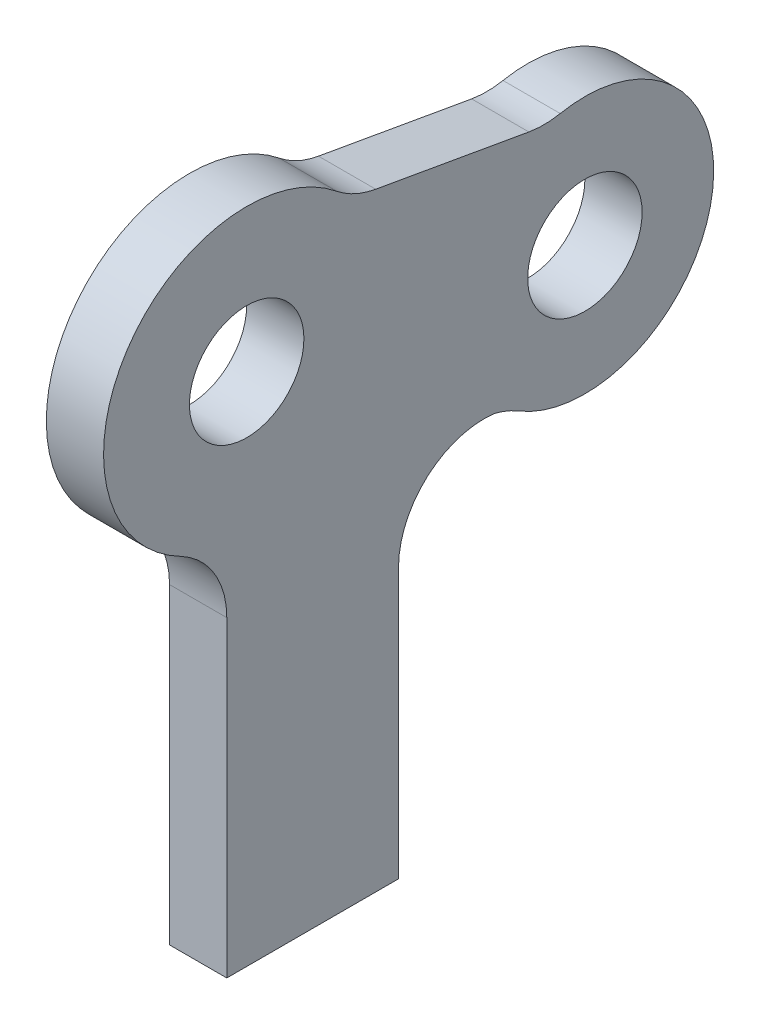
ISO-10303-21;
HEADER;
FILE_DESCRIPTION(('STEP AP214'),'2;1');
FILE_NAME('part.step','',(''),(''),'','','');
FILE_SCHEMA(('AUTOMOTIVE_DESIGN { 1 0 10303 214 1 1 1 1 }'));
ENDSEC;
DATA;
#1=APPLICATION_CONTEXT('core data for automotive mechanical design processes');
#2=APPLICATION_PROTOCOL_DEFINITION('international standard','automotive_design',2000,#1);
#3=PRODUCT_CONTEXT('',#1,'mechanical');
#4=PRODUCT('Part','Part','',(#3));
#5=PRODUCT_RELATED_PRODUCT_CATEGORY('part','',(#4));
#6=PRODUCT_DEFINITION_FORMATION('','',#4);
#7=PRODUCT_DEFINITION_CONTEXT('part definition',#1,'design');
#8=PRODUCT_DEFINITION('design','',#6,#7);
#9=PRODUCT_DEFINITION_SHAPE('','',#8);
#10=(LENGTH_UNIT() NAMED_UNIT(*) SI_UNIT(.MILLI.,.METRE.));
#11=(NAMED_UNIT(*) PLANE_ANGLE_UNIT() SI_UNIT($,.RADIAN.));
#12=(NAMED_UNIT(*) SI_UNIT($,.STERADIAN.) SOLID_ANGLE_UNIT());
#13=UNCERTAINTY_MEASURE_WITH_UNIT(LENGTH_MEASURE(1.E-05),#10,'distance_accuracy_value','');
#14=(GEOMETRIC_REPRESENTATION_CONTEXT(3) GLOBAL_UNCERTAINTY_ASSIGNED_CONTEXT((#13)) GLOBAL_UNIT_ASSIGNED_CONTEXT((#10,
#11,#12)) REPRESENTATION_CONTEXT('',''));
#15=CARTESIAN_POINT('',(0.,0.,0.));
#16=DIRECTION('',(0.,0.,1.));
#17=DIRECTION('',(1.,0.,0.));
#18=AXIS2_PLACEMENT_3D('',#15,#16,#17);
#19=CARTESIAN_POINT('',(0.,0.,0.));
#20=DIRECTION('',(1.,0.,0.));
#21=DIRECTION('',(0.,0.,-1.));
#22=AXIS2_PLACEMENT_3D('',#19,#20,#21);
#23=PLANE('',#22);
#24=CARTESIAN_POINT('',(0.,0.,0.));
#25=DIRECTION('',(1.,0.,0.));
#26=DIRECTION('',(0.,0.,-1.));
#27=AXIS2_PLACEMENT_3D('',#24,#25,#26);
#28=CIRCLE('',#27,2.);
#29=CARTESIAN_POINT('',(0.,0.,-2.));
#30=VERTEX_POINT('',#29);
#31=EDGE_CURVE('E325',#30,#30,#28,.T.);
#32=ORIENTED_EDGE('',*,*,#31,.T.);
#33=EDGE_LOOP('',(#32));
#34=FACE_BOUND('',#33,.T.);
#35=CARTESIAN_POINT('',(0.,-2.08377813200312,-11.8176930361465));
#36=DIRECTION('',(1.,0.,0.));
#37=DIRECTION('',(0.,0.,-1.));
#38=AXIS2_PLACEMENT_3D('',#35,#36,#37);
#39=CIRCLE('',#38,2.);
#40=CARTESIAN_POINT('',(0.,-2.08377813200312,-13.8176930361465));
#41=VERTEX_POINT('',#40);
#42=EDGE_CURVE('E326',#41,#41,#39,.T.);
#43=ORIENTED_EDGE('',*,*,#42,.T.);
#44=EDGE_LOOP('',(#43));
#45=FACE_BOUND('',#44,.T.);
#46=DIRECTION('',(0.,-1.,0.));
#47=VECTOR('',#46,1.);
#48=CARTESIAN_POINT('',(0.,-3.93923101204883,0.694592710667707));
#49=LINE('',#48,#47);
#50=CARTESIAN_POINT('',(0.,-7.09577231189678,0.694592710667707));
#51=VERTEX_POINT('',#50);
#52=CARTESIAN_POINT('',(0.,-18.,0.694592710667706));
#53=VERTEX_POINT('',#52);
#54=EDGE_CURVE('E212',#51,#53,#49,.T.);
#55=ORIENTED_EDGE('',*,*,#54,.F.);
#56=CARTESIAN_POINT('',(0.,-7.09577231189678,3.69459271066771));
#57=DIRECTION('',(1.,0.,0.));
#58=DIRECTION('',(0.,0.,-1.));
#59=AXIS2_PLACEMENT_3D('',#56,#57,#58);
#60=CIRCLE('',#59,3.);
#61=CARTESIAN_POINT('',(0.,-4.43485769493549,2.30912044416732));
#62=VERTEX_POINT('',#61);
#63=EDGE_CURVE('E113',#51,#62,#60,.T.);
#64=ORIENTED_EDGE('',*,*,#63,.T.);
#65=CARTESIAN_POINT('',(0.,0.,0.));
#66=DIRECTION('',(1.,0.,0.));
#67=DIRECTION('',(0.,0.,-1.));
#68=AXIS2_PLACEMENT_3D('',#65,#66,#67);
#69=CIRCLE('',#68,5.);
#70=CARTESIAN_POINT('',(0.,3.88819860680137,-3.14355079393795));
#71=VERTEX_POINT('',#70);
#72=EDGE_CURVE('E258',#71,#62,#69,.T.);
#73=ORIENTED_EDGE('',*,*,#72,.F.);
#74=CARTESIAN_POINT('',(0.,6.22111777088219,-5.02968127030071));
#75=DIRECTION('',(1.,0.,0.));
#76=DIRECTION('',(0.,0.,-1.));
#77=AXIS2_PLACEMENT_3D('',#74,#75,#76);
#78=CIRCLE('',#77,3.);
#79=CARTESIAN_POINT('',(0.,3.26669451184556,-4.50873673729993));
#80=VERTEX_POINT('',#79);
#81=EDGE_CURVE('E251',#71,#80,#78,.T.);
#82=ORIENTED_EDGE('',*,*,#81,.T.);
#83=DIRECTION('',(0.,-0.173648177666926,-0.984807753012209));
#84=VECTOR('',#83,1.);
#85=CARTESIAN_POINT('',(0.,3.93923101204883,-0.694592710667706));
#86=LINE('',#85,#84);
#87=CARTESIAN_POINT('',(0.,2.3230149076432,-9.86060972015695));
#88=VERTEX_POINT('',#87);
#89=EDGE_CURVE('E335',#80,#88,#86,.T.);
#90=ORIENTED_EDGE('',*,*,#89,.T.);
#91=CARTESIAN_POINT('',(0.,5.27743816667983,-10.3815542531577));
#92=DIRECTION('',(1.,0.,0.));
#93=DIRECTION('',(0.,0.,-1.));
#94=AXIS2_PLACEMENT_3D('',#91,#92,#93);
#95=CIRCLE('',#94,3.);
#96=CARTESIAN_POINT('',(0.,2.33295164720665,-10.9560097663532));
#97=VERTEX_POINT('',#96);
#98=EDGE_CURVE('E245',#88,#97,#95,.T.);
#99=ORIENTED_EDGE('',*,*,#98,.T.);
#100=CARTESIAN_POINT('',(0.,-2.08377813200312,-11.8176930361465));
#101=DIRECTION('',(1.,0.,0.));
#102=DIRECTION('',(0.,0.,-1.));
#103=AXIS2_PLACEMENT_3D('',#100,#101,#102);
#104=CIRCLE('',#103,4.5);
#105=CARTESIAN_POINT('',(0.,-5.93943347809591,-9.49736507395105));
#106=VERTEX_POINT('',#105);
#107=EDGE_CURVE('E214',#106,#97,#104,.T.);
#108=ORIENTED_EDGE('',*,*,#107,.F.);
#109=CARTESIAN_POINT('',(0.,-8.5098703754911,-7.95047976582075));
#110=DIRECTION('',(1.,0.,0.));
#111=DIRECTION('',(0.,0.,-1.));
#112=AXIS2_PLACEMENT_3D('',#109,#110,#111);
#113=CIRCLE('',#112,3.);
#114=CARTESIAN_POINT('',(0.,-5.5920734525664,-8.64794741135793));
#115=VERTEX_POINT('',#114);
#116=EDGE_CURVE('E128',#106,#115,#113,.T.);
#117=ORIENTED_EDGE('',*,*,#116,.T.);
#118=CARTESIAN_POINT('',(0.,-8.57245367408222,-8.30540728933229));
#119=DIRECTION('',(1.,0.,0.));
#120=DIRECTION('',(0.,0.,-1.));
#121=AXIS2_PLACEMENT_3D('',#118,#119,#120);
#122=CIRCLE('',#121,3.);
#123=CARTESIAN_POINT('',(0.,-8.57245367408222,-5.30540728933229));
#124=VERTEX_POINT('',#123);
#125=EDGE_CURVE('E253',#115,#124,#122,.T.);
#126=ORIENTED_EDGE('',*,*,#125,.T.);
#127=DIRECTION('',(0.,-1.,0.));
#128=VECTOR('',#127,1.);
#129=CARTESIAN_POINT('',(0.,-3.93923101204883,-5.30540728933229));
#130=LINE('',#129,#128);
#131=CARTESIAN_POINT('',(0.,-18.,-5.30540728933229));
#132=VERTEX_POINT('',#131);
#133=EDGE_CURVE('E199',#124,#132,#130,.T.);
#134=ORIENTED_EDGE('',*,*,#133,.T.);
#135=DIRECTION('',(0.,0.,-1.));
#136=VECTOR('',#135,1.);
#137=CARTESIAN_POINT('',(0.,-18.,0.694592710667706));
#138=LINE('',#137,#136);
#139=EDGE_CURVE('E328',#53,#132,#138,.T.);
#140=ORIENTED_EDGE('',*,*,#139,.F.);
#141=EDGE_LOOP('',(#55,#64,#73,#82,#90,#99,#108,#117,#126,#134,#140));
#142=FACE_BOUND('',#141,.T.);
#143=ADVANCED_FACE('F104',(#34,#45,#142),#23,.F.);
#144=CARTESIAN_POINT('',(2.,0.,0.));
#145=DIRECTION('',(1.,0.,0.));
#146=DIRECTION('',(0.,0.,-1.));
#147=AXIS2_PLACEMENT_3D('',#144,#145,#146);
#148=PLANE('',#147);
#149=CARTESIAN_POINT('',(2.,0.,0.));
#150=DIRECTION('',(1.,0.,0.));
#151=DIRECTION('',(0.,0.,-1.));
#152=AXIS2_PLACEMENT_3D('',#149,#150,#151);
#153=CIRCLE('',#152,2.);
#154=CARTESIAN_POINT('',(2.,0.,-2.));
#155=VERTEX_POINT('',#154);
#156=EDGE_CURVE('E323',#155,#155,#153,.T.);
#157=ORIENTED_EDGE('',*,*,#156,.F.);
#158=EDGE_LOOP('',(#157));
#159=FACE_BOUND('',#158,.T.);
#160=CARTESIAN_POINT('',(2.,-2.08377813200312,-11.8176930361465));
#161=DIRECTION('',(1.,0.,0.));
#162=DIRECTION('',(0.,0.,-1.));
#163=AXIS2_PLACEMENT_3D('',#160,#161,#162);
#164=CIRCLE('',#163,2.);
#165=CARTESIAN_POINT('',(2.,-2.08377813200312,-13.8176930361465));
#166=VERTEX_POINT('',#165);
#167=EDGE_CURVE('E347',#166,#166,#164,.T.);
#168=ORIENTED_EDGE('',*,*,#167,.F.);
#169=EDGE_LOOP('',(#168));
#170=FACE_BOUND('',#169,.T.);
#171=DIRECTION('',(0.,-0.173648177666926,-0.984807753012209));
#172=VECTOR('',#171,1.);
#173=CARTESIAN_POINT('',(2.,3.93923101204883,-0.694592710667706));
#174=LINE('',#173,#172);
#175=CARTESIAN_POINT('',(2.,3.26669451184556,-4.50873673729993));
#176=VERTEX_POINT('',#175);
#177=CARTESIAN_POINT('',(2.,2.3230149076432,-9.86060972015695));
#178=VERTEX_POINT('',#177);
#179=EDGE_CURVE('E225',#176,#178,#174,.T.);
#180=ORIENTED_EDGE('',*,*,#179,.F.);
#181=CARTESIAN_POINT('',(2.,6.22111777088219,-5.02968127030071));
#182=DIRECTION('',(1.,0.,0.));
#183=DIRECTION('',(0.,0.,-1.));
#184=AXIS2_PLACEMENT_3D('',#181,#182,#183);
#185=CIRCLE('',#184,3.);
#186=CARTESIAN_POINT('',(2.,3.88819860680137,-3.14355079393795));
#187=VERTEX_POINT('',#186);
#188=EDGE_CURVE('E249',#176,#187,#185,.F.);
#189=ORIENTED_EDGE('',*,*,#188,.T.);
#190=CARTESIAN_POINT('',(2.,0.,0.));
#191=DIRECTION('',(1.,0.,0.));
#192=DIRECTION('',(0.,0.,-1.));
#193=AXIS2_PLACEMENT_3D('',#190,#191,#192);
#194=CIRCLE('',#193,5.);
#195=CARTESIAN_POINT('',(2.,-4.43485769493549,2.30912044416732));
#196=VERTEX_POINT('',#195);
#197=EDGE_CURVE('E266',#187,#196,#194,.T.);
#198=ORIENTED_EDGE('',*,*,#197,.T.);
#199=CARTESIAN_POINT('',(2.,-7.09577231189678,3.69459271066771));
#200=DIRECTION('',(1.,0.,0.));
#201=DIRECTION('',(0.,0.,-1.));
#202=AXIS2_PLACEMENT_3D('',#199,#200,#201);
#203=CIRCLE('',#202,3.);
#204=CARTESIAN_POINT('',(2.,-7.09577231189678,0.694592710667707));
#205=VERTEX_POINT('',#204);
#206=EDGE_CURVE('E12',#196,#205,#203,.F.);
#207=ORIENTED_EDGE('',*,*,#206,.T.);
#208=DIRECTION('',(0.,-1.,0.));
#209=VECTOR('',#208,1.);
#210=CARTESIAN_POINT('',(2.,-3.93923101204883,0.694592710667707));
#211=LINE('',#210,#209);
#212=CARTESIAN_POINT('',(2.,-18.,0.694592710667706));
#213=VERTEX_POINT('',#212);
#214=EDGE_CURVE('E187',#205,#213,#211,.T.);
#215=ORIENTED_EDGE('',*,*,#214,.T.);
#216=DIRECTION('',(0.,0.,-1.));
#217=VECTOR('',#216,1.);
#218=CARTESIAN_POINT('',(2.,-18.,0.694592710667706));
#219=LINE('',#218,#217);
#220=CARTESIAN_POINT('',(2.,-18.,-5.30540728933229));
#221=VERTEX_POINT('',#220);
#222=EDGE_CURVE('E191',#213,#221,#219,.T.);
#223=ORIENTED_EDGE('',*,*,#222,.T.);
#224=DIRECTION('',(0.,-1.,0.));
#225=VECTOR('',#224,1.);
#226=CARTESIAN_POINT('',(2.,-3.93923101204883,-5.30540728933229));
#227=LINE('',#226,#225);
#228=CARTESIAN_POINT('',(2.,-8.57245367408222,-5.30540728933229));
#229=VERTEX_POINT('',#228);
#230=EDGE_CURVE('E208',#229,#221,#227,.T.);
#231=ORIENTED_EDGE('',*,*,#230,.F.);
#232=CARTESIAN_POINT('',(2.,-8.57245367408222,-8.30540728933229));
#233=DIRECTION('',(1.,0.,0.));
#234=DIRECTION('',(0.,0.,-1.));
#235=AXIS2_PLACEMENT_3D('',#232,#233,#234);
#236=CIRCLE('',#235,3.);
#237=CARTESIAN_POINT('',(2.,-5.5920734525664,-8.64794741135793));
#238=VERTEX_POINT('',#237);
#239=EDGE_CURVE('E120',#229,#238,#236,.F.);
#240=ORIENTED_EDGE('',*,*,#239,.T.);
#241=CARTESIAN_POINT('',(2.,-8.5098703754911,-7.95047976582075));
#242=DIRECTION('',(1.,0.,0.));
#243=DIRECTION('',(0.,0.,-1.));
#244=AXIS2_PLACEMENT_3D('',#241,#242,#243);
#245=CIRCLE('',#244,3.);
#246=CARTESIAN_POINT('',(2.,-5.93943347809591,-9.49736507395105));
#247=VERTEX_POINT('',#246);
#248=EDGE_CURVE('E243',#238,#247,#245,.F.);
#249=ORIENTED_EDGE('',*,*,#248,.T.);
#250=CARTESIAN_POINT('',(2.,-2.08377813200312,-11.8176930361465));
#251=DIRECTION('',(1.,0.,0.));
#252=DIRECTION('',(0.,0.,-1.));
#253=AXIS2_PLACEMENT_3D('',#250,#251,#252);
#254=CIRCLE('',#253,4.5);
#255=CARTESIAN_POINT('',(2.,2.33295164720665,-10.9560097663532));
#256=VERTEX_POINT('',#255);
#257=EDGE_CURVE('E217',#247,#256,#254,.T.);
#258=ORIENTED_EDGE('',*,*,#257,.T.);
#259=CARTESIAN_POINT('',(2.,5.27743816667983,-10.3815542531577));
#260=DIRECTION('',(1.,0.,0.));
#261=DIRECTION('',(0.,0.,-1.));
#262=AXIS2_PLACEMENT_3D('',#259,#260,#261);
#263=CIRCLE('',#262,3.);
#264=EDGE_CURVE('E247',#256,#178,#263,.F.);
#265=ORIENTED_EDGE('',*,*,#264,.T.);
#266=EDGE_LOOP('',(#180,#189,#198,#207,#215,#223,#231,#240,#249,#258,#265));
#267=FACE_BOUND('',#266,.T.);
#268=ADVANCED_FACE('F190',(#159,#170,#267),#148,.T.);
#269=CARTESIAN_POINT('',(2.,3.93923101204883,-0.694592710667706));
#270=DIRECTION('',(0.,0.984807753012209,-0.173648177666926));
#271=DIRECTION('',(0.,0.173648177666926,0.984807753012209));
#272=AXIS2_PLACEMENT_3D('',#269,#270,#271);
#273=PLANE('',#272);
#274=ORIENTED_EDGE('',*,*,#179,.T.);
#275=DIRECTION('',(-1.,0.,0.));
#276=VECTOR('',#275,1.);
#277=CARTESIAN_POINT('',(2.,2.3230149076432,-9.86060972015695));
#278=LINE('',#277,#276);
#279=EDGE_CURVE('E231',#178,#88,#278,.T.);
#280=ORIENTED_EDGE('',*,*,#279,.T.);
#281=ORIENTED_EDGE('',*,*,#89,.F.);
#282=DIRECTION('',(-1.,0.,0.));
#283=VECTOR('',#282,1.);
#284=CARTESIAN_POINT('',(2.,3.26669451184556,-4.50873673729993));
#285=LINE('',#284,#283);
#286=EDGE_CURVE('E228',#80,#176,#285,.F.);
#287=ORIENTED_EDGE('',*,*,#286,.T.);
#288=EDGE_LOOP('',(#274,#280,#281,#287));
#289=FACE_BOUND('',#288,.T.);
#290=ADVANCED_FACE('F275',(#289),#273,.T.);
#291=CARTESIAN_POINT('',(2.,0.,0.));
#292=DIRECTION('',(-1.,0.,0.));
#293=DIRECTION('',(0.,0.,1.));
#294=AXIS2_PLACEMENT_3D('',#291,#292,#293);
#295=CYLINDRICAL_SURFACE('',#294,5.);
#296=ORIENTED_EDGE('',*,*,#197,.F.);
#297=DIRECTION('',(-1.,0.,0.));
#298=VECTOR('',#297,1.);
#299=CARTESIAN_POINT('',(2.,3.88819860680137,-3.14355079393795));
#300=LINE('',#299,#298);
#301=EDGE_CURVE('E236',#187,#71,#300,.T.);
#302=ORIENTED_EDGE('',*,*,#301,.T.);
#303=ORIENTED_EDGE('',*,*,#72,.T.);
#304=DIRECTION('',(-1.,0.,0.));
#305=VECTOR('',#304,1.);
#306=CARTESIAN_POINT('',(2.,-4.43485769493549,2.30912044416732));
#307=LINE('',#306,#305);
#308=EDGE_CURVE('E234',#62,#196,#307,.F.);
#309=ORIENTED_EDGE('',*,*,#308,.T.);
#310=EDGE_LOOP('',(#296,#302,#303,#309));
#311=FACE_BOUND('',#310,.T.);
#312=ADVANCED_FACE('F264',(#311),#295,.T.);
#313=CARTESIAN_POINT('',(2.,-3.93923101204883,0.694592710667707));
#314=DIRECTION('',(0.,0.,-1.));
#315=DIRECTION('',(0.,1.,0.));
#316=AXIS2_PLACEMENT_3D('',#313,#314,#315);
#317=PLANE('',#316);
#318=ORIENTED_EDGE('',*,*,#214,.F.);
#319=DIRECTION('',(1.,0.,0.));
#320=VECTOR('',#319,1.);
#321=CARTESIAN_POINT('',(0.,-7.09577231189678,0.694592710667707));
#322=LINE('',#321,#320);
#323=EDGE_CURVE('E240',#205,#51,#322,.F.);
#324=ORIENTED_EDGE('',*,*,#323,.T.);
#325=ORIENTED_EDGE('',*,*,#54,.T.);
#326=DIRECTION('',(-1.,0.,0.));
#327=VECTOR('',#326,1.);
#328=CARTESIAN_POINT('',(2.,-18.,0.694592710667706));
#329=LINE('',#328,#327);
#330=EDGE_CURVE('E205',#213,#53,#329,.T.);
#331=ORIENTED_EDGE('',*,*,#330,.F.);
#332=EDGE_LOOP('',(#318,#324,#325,#331));
#333=FACE_BOUND('',#332,.T.);
#334=ADVANCED_FACE('F210',(#333),#317,.F.);
#335=CARTESIAN_POINT('',(2.,-18.,0.694592710667706));
#336=DIRECTION('',(0.,1.,0.));
#337=DIRECTION('',(0.,0.,1.));
#338=AXIS2_PLACEMENT_3D('',#335,#336,#337);
#339=PLANE('',#338);
#340=ORIENTED_EDGE('',*,*,#139,.T.);
#341=DIRECTION('',(-1.,0.,0.));
#342=VECTOR('',#341,1.);
#343=CARTESIAN_POINT('',(2.,-18.,-5.30540728933229));
#344=LINE('',#343,#342);
#345=EDGE_CURVE('E207',#221,#132,#344,.T.);
#346=ORIENTED_EDGE('',*,*,#345,.F.);
#347=ORIENTED_EDGE('',*,*,#222,.F.);
#348=ORIENTED_EDGE('',*,*,#330,.T.);
#349=EDGE_LOOP('',(#340,#346,#347,#348));
#350=FACE_BOUND('',#349,.T.);
#351=ADVANCED_FACE('F204',(#350),#339,.F.);
#352=CARTESIAN_POINT('',(2.,-3.93923101204883,-5.30540728933229));
#353=DIRECTION('',(0.,0.,-1.));
#354=DIRECTION('',(0.,1.,0.));
#355=AXIS2_PLACEMENT_3D('',#352,#353,#354);
#356=PLANE('',#355);
#357=ORIENTED_EDGE('',*,*,#133,.F.);
#358=DIRECTION('',(-1.,0.,0.));
#359=VECTOR('',#358,1.);
#360=CARTESIAN_POINT('',(2.,-8.57245367408222,-5.30540728933229));
#361=LINE('',#360,#359);
#362=EDGE_CURVE('E238',#124,#229,#361,.F.);
#363=ORIENTED_EDGE('',*,*,#362,.T.);
#364=ORIENTED_EDGE('',*,*,#230,.T.);
#365=ORIENTED_EDGE('',*,*,#345,.T.);
#366=EDGE_LOOP('',(#357,#363,#364,#365));
#367=FACE_BOUND('',#366,.T.);
#368=ADVANCED_FACE('F288',(#367),#356,.T.);
#369=CARTESIAN_POINT('',(2.,-2.08377813200312,-11.8176930361465));
#370=DIRECTION('',(-1.,0.,0.));
#371=DIRECTION('',(0.,0.,1.));
#372=AXIS2_PLACEMENT_3D('',#369,#370,#371);
#373=CYLINDRICAL_SURFACE('',#372,4.5);
#374=ORIENTED_EDGE('',*,*,#257,.F.);
#375=DIRECTION('',(-1.,0.,0.));
#376=VECTOR('',#375,1.);
#377=CARTESIAN_POINT('',(2.,-5.93943347809591,-9.49736507395105));
#378=LINE('',#377,#376);
#379=EDGE_CURVE('E224',#247,#106,#378,.T.);
#380=ORIENTED_EDGE('',*,*,#379,.T.);
#381=ORIENTED_EDGE('',*,*,#107,.T.);
#382=DIRECTION('',(-1.,0.,0.));
#383=VECTOR('',#382,1.);
#384=CARTESIAN_POINT('',(2.,2.33295164720665,-10.9560097663532));
#385=LINE('',#384,#383);
#386=EDGE_CURVE('E222',#97,#256,#385,.F.);
#387=ORIENTED_EDGE('',*,*,#386,.T.);
#388=EDGE_LOOP('',(#374,#380,#381,#387));
#389=FACE_BOUND('',#388,.T.);
#390=ADVANCED_FACE('F279',(#389),#373,.T.);
#391=CARTESIAN_POINT('',(-1.2E-05,-2.08377813200312,-11.8176930361465));
#392=DIRECTION('',(1.,0.,0.));
#393=DIRECTION('',(0.,0.,-1.));
#394=AXIS2_PLACEMENT_3D('',#391,#392,#393);
#395=CYLINDRICAL_SURFACE('',#394,2.);
#396=CARTESIAN_POINT('',(2.,-2.08377813200312,-13.8176930361465));
#397=CARTESIAN_POINT('',(1.97916666666667,-2.08377813200312,-13.8176930361465));
#398=CARTESIAN_POINT('',(1.95833333333333,-2.08377813200312,-13.8176930361465));
#399=CARTESIAN_POINT('',(1.91666666666667,-2.08377813200312,-13.8176930361465));
#400=CARTESIAN_POINT('',(1.89583333333333,-2.08377813200312,-13.8176930361465));
#401=CARTESIAN_POINT('',(1.85416666666667,-2.08377813200312,-13.8176930361465));
#402=CARTESIAN_POINT('',(1.83333333333333,-2.08377813200312,-13.8176930361465));
#403=CARTESIAN_POINT('',(1.79166666666667,-2.08377813200312,-13.8176930361465));
#404=CARTESIAN_POINT('',(1.77083333333333,-2.08377813200312,-13.8176930361465));
#405=CARTESIAN_POINT('',(1.72916666666667,-2.08377813200312,-13.8176930361465));
#406=CARTESIAN_POINT('',(1.70833333333333,-2.08377813200312,-13.8176930361465));
#407=CARTESIAN_POINT('',(1.66666666666667,-2.08377813200312,-13.8176930361465));
#408=CARTESIAN_POINT('',(1.64583333333333,-2.08377813200312,-13.8176930361465));
#409=CARTESIAN_POINT('',(1.60416666666667,-2.08377813200312,-13.8176930361465));
#410=CARTESIAN_POINT('',(1.58333333333333,-2.08377813200312,-13.8176930361465));
#411=CARTESIAN_POINT('',(1.54166666666667,-2.08377813200312,-13.8176930361465));
#412=CARTESIAN_POINT('',(1.52083333333333,-2.08377813200312,-13.8176930361465));
#413=CARTESIAN_POINT('',(1.47916666666667,-2.08377813200312,-13.8176930361465));
#414=CARTESIAN_POINT('',(1.45833333333333,-2.08377813200312,-13.8176930361465));
#415=CARTESIAN_POINT('',(1.41666666666667,-2.08377813200312,-13.8176930361465));
#416=CARTESIAN_POINT('',(1.39583333333333,-2.08377813200312,-13.8176930361465));
#417=CARTESIAN_POINT('',(1.35416666666667,-2.08377813200312,-13.8176930361465));
#418=CARTESIAN_POINT('',(1.33333333333333,-2.08377813200312,-13.8176930361465));
#419=CARTESIAN_POINT('',(1.29166666666667,-2.08377813200312,-13.8176930361465));
#420=CARTESIAN_POINT('',(1.27083333333333,-2.08377813200312,-13.8176930361465));
#421=CARTESIAN_POINT('',(1.22916666666667,-2.08377813200312,-13.8176930361465));
#422=CARTESIAN_POINT('',(1.20833333333333,-2.08377813200312,-13.8176930361465));
#423=CARTESIAN_POINT('',(1.16666666666667,-2.08377813200312,-13.8176930361465));
#424=CARTESIAN_POINT('',(1.14583333333333,-2.08377813200312,-13.8176930361465));
#425=CARTESIAN_POINT('',(1.10416666666667,-2.08377813200312,-13.8176930361465));
#426=CARTESIAN_POINT('',(1.08333333333333,-2.08377813200312,-13.8176930361465));
#427=CARTESIAN_POINT('',(1.04166666666667,-2.08377813200312,-13.8176930361465));
#428=CARTESIAN_POINT('',(1.02083333333333,-2.08377813200312,-13.8176930361465));
#429=CARTESIAN_POINT('',(0.979166666666667,-2.08377813200312,-13.8176930361465));
#430=CARTESIAN_POINT('',(0.958333333333334,-2.08377813200312,-13.8176930361465));
#431=CARTESIAN_POINT('',(0.916666666666667,-2.08377813200312,-13.8176930361465));
#432=CARTESIAN_POINT('',(0.895833333333334,-2.08377813200312,-13.8176930361465));
#433=CARTESIAN_POINT('',(0.854166666666667,-2.08377813200312,-13.8176930361465));
#434=CARTESIAN_POINT('',(0.833333333333334,-2.08377813200312,-13.8176930361465));
#435=CARTESIAN_POINT('',(0.791666666666667,-2.08377813200312,-13.8176930361465));
#436=CARTESIAN_POINT('',(0.770833333333334,-2.08377813200312,-13.8176930361465));
#437=CARTESIAN_POINT('',(0.729166666666667,-2.08377813200312,-13.8176930361465));
#438=CARTESIAN_POINT('',(0.708333333333334,-2.08377813200312,-13.8176930361465));
#439=CARTESIAN_POINT('',(0.666666666666667,-2.08377813200312,-13.8176930361465));
#440=CARTESIAN_POINT('',(0.645833333333334,-2.08377813200312,-13.8176930361465));
#441=CARTESIAN_POINT('',(0.604166666666667,-2.08377813200312,-13.8176930361465));
#442=CARTESIAN_POINT('',(0.583333333333333,-2.08377813200312,-13.8176930361465));
#443=CARTESIAN_POINT('',(0.541666666666667,-2.08377813200312,-13.8176930361465));
#444=CARTESIAN_POINT('',(0.520833333333333,-2.08377813200312,-13.8176930361465));
#445=CARTESIAN_POINT('',(0.479166666666667,-2.08377813200312,-13.8176930361465));
#446=CARTESIAN_POINT('',(0.458333333333334,-2.08377813200312,-13.8176930361465));
#447=CARTESIAN_POINT('',(0.416666666666667,-2.08377813200312,-13.8176930361465));
#448=CARTESIAN_POINT('',(0.395833333333334,-2.08377813200312,-13.8176930361465));
#449=CARTESIAN_POINT('',(0.354166666666667,-2.08377813200312,-13.8176930361465));
#450=CARTESIAN_POINT('',(0.333333333333334,-2.08377813200312,-13.8176930361465));
#451=CARTESIAN_POINT('',(0.291666666666667,-2.08377813200312,-13.8176930361465));
#452=CARTESIAN_POINT('',(0.270833333333333,-2.08377813200312,-13.8176930361465));
#453=CARTESIAN_POINT('',(0.229166666666667,-2.08377813200312,-13.8176930361465));
#454=CARTESIAN_POINT('',(0.208333333333333,-2.08377813200312,-13.8176930361465));
#455=CARTESIAN_POINT('',(0.166666666666667,-2.08377813200312,-13.8176930361465));
#456=CARTESIAN_POINT('',(0.145833333333334,-2.08377813200312,-13.8176930361465));
#457=CARTESIAN_POINT('',(0.104166666666667,-2.08377813200312,-13.8176930361465));
#458=CARTESIAN_POINT('',(0.0833333333333336,-2.08377813200312,-13.8176930361465));
#459=CARTESIAN_POINT('',(0.0416666666666669,-2.08377813200312,-13.8176930361465));
#460=CARTESIAN_POINT('',(0.0208333333333335,-2.08377813200312,-13.8176930361465));
#461=CARTESIAN_POINT('',(0.,-2.08377813200312,-13.8176930361465));
#462=B_SPLINE_CURVE_WITH_KNOTS('',3,(#396,#397,#398,#399,#400,#401,#402,#403,#404,#405,#406,
#407,#408,#409,#410,#411,#412,#413,#414,#415,#416,#417,#418,#419,#420,#421,#422,#423,#424,#425,
#426,#427,#428,#429,#430,#431,#432,#433,#434,#435,#436,#437,#438,#439,#440,#441,#442,#443,#444,
#445,#446,#447,#448,#449,#450,#451,#452,#453,#454,#455,#456,#457,#458,#459,#460,#461),
.UNSPECIFIED.,.F.,.F.,(4,2,2,2,2,2,2,2,2,2,2,2,2,2,2,2,2,2,2,2,2,2,2,2,2,2,2,2,2,2,2,2,4),(0.,
0.0624999999999996,0.125,0.1875,0.25,0.3125,0.375,0.4375,0.5,0.5625,0.625,0.6875,0.75,0.8125,
0.875,0.9375,1.,1.0625,1.125,1.1875,1.25,1.3125,1.375,1.4375,1.5,1.5625,1.625,1.6875,1.75,
1.8125,1.875,1.9375,2.),.UNSPECIFIED.);
#463=EDGE_CURVE('BSEAM287',#166,#41,#462,.T.);
#464=ORIENTED_EDGE('',*,*,#167,.T.);
#465=ORIENTED_EDGE('',*,*,#42,.F.);
#466=ORIENTED_EDGE('',*,*,#463,.T.);
#467=ORIENTED_EDGE('',*,*,#463,.F.);
#468=EDGE_LOOP('',(#464,#466,#465,#467));
#469=FACE_BOUND('',#468,.T.);
#470=ADVANCED_FACE('F287',(#469),#395,.F.);
#471=CARTESIAN_POINT('',(-1.2E-05,0.,0.));
#472=DIRECTION('',(1.,0.,0.));
#473=DIRECTION('',(0.,0.,-1.));
#474=AXIS2_PLACEMENT_3D('',#471,#472,#473);
#475=CYLINDRICAL_SURFACE('',#474,2.);
#476=CARTESIAN_POINT('',(2.,0.,-2.));
#477=CARTESIAN_POINT('',(1.97916666666667,0.,-2.));
#478=CARTESIAN_POINT('',(1.95833333333333,0.,-2.));
#479=CARTESIAN_POINT('',(1.91666666666667,0.,-2.));
#480=CARTESIAN_POINT('',(1.89583333333333,0.,-2.));
#481=CARTESIAN_POINT('',(1.85416666666667,0.,-2.));
#482=CARTESIAN_POINT('',(1.83333333333333,0.,-2.));
#483=CARTESIAN_POINT('',(1.79166666666667,0.,-2.));
#484=CARTESIAN_POINT('',(1.77083333333333,0.,-2.));
#485=CARTESIAN_POINT('',(1.72916666666667,0.,-2.));
#486=CARTESIAN_POINT('',(1.70833333333333,0.,-2.));
#487=CARTESIAN_POINT('',(1.66666666666667,0.,-2.));
#488=CARTESIAN_POINT('',(1.64583333333333,0.,-2.));
#489=CARTESIAN_POINT('',(1.60416666666667,0.,-2.));
#490=CARTESIAN_POINT('',(1.58333333333333,0.,-2.));
#491=CARTESIAN_POINT('',(1.54166666666667,0.,-2.));
#492=CARTESIAN_POINT('',(1.52083333333333,0.,-2.));
#493=CARTESIAN_POINT('',(1.47916666666667,0.,-2.));
#494=CARTESIAN_POINT('',(1.45833333333333,0.,-2.));
#495=CARTESIAN_POINT('',(1.41666666666667,0.,-2.));
#496=CARTESIAN_POINT('',(1.39583333333333,0.,-2.));
#497=CARTESIAN_POINT('',(1.35416666666667,0.,-2.));
#498=CARTESIAN_POINT('',(1.33333333333333,0.,-2.));
#499=CARTESIAN_POINT('',(1.29166666666667,0.,-2.));
#500=CARTESIAN_POINT('',(1.27083333333333,0.,-2.));
#501=CARTESIAN_POINT('',(1.22916666666667,0.,-2.));
#502=CARTESIAN_POINT('',(1.20833333333333,0.,-2.));
#503=CARTESIAN_POINT('',(1.16666666666667,0.,-2.));
#504=CARTESIAN_POINT('',(1.14583333333333,0.,-2.));
#505=CARTESIAN_POINT('',(1.10416666666667,0.,-2.));
#506=CARTESIAN_POINT('',(1.08333333333333,0.,-2.));
#507=CARTESIAN_POINT('',(1.04166666666667,0.,-2.));
#508=CARTESIAN_POINT('',(1.02083333333333,0.,-2.));
#509=CARTESIAN_POINT('',(0.979166666666667,0.,-2.));
#510=CARTESIAN_POINT('',(0.958333333333334,0.,-2.));
#511=CARTESIAN_POINT('',(0.916666666666667,0.,-2.));
#512=CARTESIAN_POINT('',(0.895833333333334,0.,-2.));
#513=CARTESIAN_POINT('',(0.854166666666667,0.,-2.));
#514=CARTESIAN_POINT('',(0.833333333333334,0.,-2.));
#515=CARTESIAN_POINT('',(0.791666666666667,0.,-2.));
#516=CARTESIAN_POINT('',(0.770833333333334,0.,-2.));
#517=CARTESIAN_POINT('',(0.729166666666667,0.,-2.));
#518=CARTESIAN_POINT('',(0.708333333333334,0.,-2.));
#519=CARTESIAN_POINT('',(0.666666666666667,0.,-2.));
#520=CARTESIAN_POINT('',(0.645833333333334,0.,-2.));
#521=CARTESIAN_POINT('',(0.604166666666667,0.,-2.));
#522=CARTESIAN_POINT('',(0.583333333333333,0.,-2.));
#523=CARTESIAN_POINT('',(0.541666666666667,0.,-2.));
#524=CARTESIAN_POINT('',(0.520833333333333,0.,-2.));
#525=CARTESIAN_POINT('',(0.479166666666667,0.,-2.));
#526=CARTESIAN_POINT('',(0.458333333333334,0.,-2.));
#527=CARTESIAN_POINT('',(0.416666666666667,0.,-2.));
#528=CARTESIAN_POINT('',(0.395833333333334,0.,-2.));
#529=CARTESIAN_POINT('',(0.354166666666667,0.,-2.));
#530=CARTESIAN_POINT('',(0.333333333333334,0.,-2.));
#531=CARTESIAN_POINT('',(0.291666666666667,0.,-2.));
#532=CARTESIAN_POINT('',(0.270833333333333,0.,-2.));
#533=CARTESIAN_POINT('',(0.229166666666667,0.,-2.));
#534=CARTESIAN_POINT('',(0.208333333333333,0.,-2.));
#535=CARTESIAN_POINT('',(0.166666666666667,0.,-2.));
#536=CARTESIAN_POINT('',(0.145833333333334,0.,-2.));
#537=CARTESIAN_POINT('',(0.104166666666667,0.,-2.));
#538=CARTESIAN_POINT('',(0.0833333333333336,0.,-2.));
#539=CARTESIAN_POINT('',(0.0416666666666669,0.,-2.));
#540=CARTESIAN_POINT('',(0.0208333333333335,0.,-2.));
#541=CARTESIAN_POINT('',(0.,0.,-2.));
#542=B_SPLINE_CURVE_WITH_KNOTS('',3,(#476,#477,#478,#479,#480,#481,#482,#483,#484,#485,#486,
#487,#488,#489,#490,#491,#492,#493,#494,#495,#496,#497,#498,#499,#500,#501,#502,#503,#504,#505,
#506,#507,#508,#509,#510,#511,#512,#513,#514,#515,#516,#517,#518,#519,#520,#521,#522,#523,#524,
#525,#526,#527,#528,#529,#530,#531,#532,#533,#534,#535,#536,#537,#538,#539,#540,#541),
.UNSPECIFIED.,.F.,.F.,(4,2,2,2,2,2,2,2,2,2,2,2,2,2,2,2,2,2,2,2,2,2,2,2,2,2,2,2,2,2,2,2,4),(0.,
0.0624999999999996,0.125,0.1875,0.25,0.3125,0.375,0.4375,0.5,0.5625,0.625,0.6875,0.75,0.8125,
0.875,0.9375,1.,1.0625,1.125,1.1875,1.25,1.3125,1.375,1.4375,1.5,1.5625,1.625,1.6875,1.75,
1.8125,1.875,1.9375,2.),.UNSPECIFIED.);
#543=EDGE_CURVE('BSEAM298',#155,#30,#542,.T.);
#544=ORIENTED_EDGE('',*,*,#156,.T.);
#545=ORIENTED_EDGE('',*,*,#31,.F.);
#546=ORIENTED_EDGE('',*,*,#543,.T.);
#547=ORIENTED_EDGE('',*,*,#543,.F.);
#548=EDGE_LOOP('',(#544,#546,#545,#547));
#549=FACE_BOUND('',#548,.T.);
#550=ADVANCED_FACE('F298',(#549),#475,.F.);
#551=CARTESIAN_POINT('',(2.,-8.57245367408222,-8.30540728933229));
#552=DIRECTION('',(-1.,0.,0.));
#553=DIRECTION('',(0.,0.,1.));
#554=AXIS2_PLACEMENT_3D('',#551,#552,#553);
#555=CYLINDRICAL_SURFACE('',#554,3.);
#556=DIRECTION('',(-1.,0.,0.));
#557=VECTOR('',#556,1.);
#558=CARTESIAN_POINT('',(1.,-5.5920734525664,-8.64794741135793));
#559=LINE('',#558,#557);
#560=EDGE_CURVE('E108',#238,#115,#559,.T.);
#561=ORIENTED_EDGE('',*,*,#560,.F.);
#562=ORIENTED_EDGE('',*,*,#239,.F.);
#563=ORIENTED_EDGE('',*,*,#362,.F.);
#564=ORIENTED_EDGE('',*,*,#125,.F.);
#565=EDGE_LOOP('',(#561,#562,#563,#564));
#566=FACE_BOUND('',#565,.T.);
#567=ADVANCED_FACE('F312',(#566),#555,.F.);
#568=CARTESIAN_POINT('',(2.,-8.5098703754911,-7.95047976582075));
#569=DIRECTION('',(-1.,0.,0.));
#570=DIRECTION('',(0.,0.,1.));
#571=AXIS2_PLACEMENT_3D('',#568,#569,#570);
#572=CYLINDRICAL_SURFACE('',#571,3.);
#573=ORIENTED_EDGE('',*,*,#248,.F.);
#574=ORIENTED_EDGE('',*,*,#560,.T.);
#575=ORIENTED_EDGE('',*,*,#116,.F.);
#576=ORIENTED_EDGE('',*,*,#379,.F.);
#577=EDGE_LOOP('',(#573,#574,#575,#576));
#578=FACE_BOUND('',#577,.T.);
#579=ADVANCED_FACE('F317',(#578),#572,.F.);
#580=CARTESIAN_POINT('',(2.,5.27743816667983,-10.3815542531577));
#581=DIRECTION('',(-1.,0.,0.));
#582=DIRECTION('',(0.,0.,1.));
#583=AXIS2_PLACEMENT_3D('',#580,#581,#582);
#584=CYLINDRICAL_SURFACE('',#583,3.);
#585=ORIENTED_EDGE('',*,*,#264,.F.);
#586=ORIENTED_EDGE('',*,*,#386,.F.);
#587=ORIENTED_EDGE('',*,*,#98,.F.);
#588=ORIENTED_EDGE('',*,*,#279,.F.);
#589=EDGE_LOOP('',(#585,#586,#587,#588));
#590=FACE_BOUND('',#589,.T.);
#591=ADVANCED_FACE('F273',(#590),#584,.F.);
#592=CARTESIAN_POINT('',(2.,6.22111777088219,-5.02968127030071));
#593=DIRECTION('',(-1.,0.,0.));
#594=DIRECTION('',(0.,0.,1.));
#595=AXIS2_PLACEMENT_3D('',#592,#593,#594);
#596=CYLINDRICAL_SURFACE('',#595,3.);
#597=ORIENTED_EDGE('',*,*,#81,.F.);
#598=ORIENTED_EDGE('',*,*,#301,.F.);
#599=ORIENTED_EDGE('',*,*,#188,.F.);
#600=ORIENTED_EDGE('',*,*,#286,.F.);
#601=EDGE_LOOP('',(#597,#598,#599,#600));
#602=FACE_BOUND('',#601,.T.);
#603=ADVANCED_FACE('F269',(#602),#596,.F.);
#604=CARTESIAN_POINT('',(2.,-7.09577231189678,3.69459271066771));
#605=DIRECTION('',(-1.,0.,0.));
#606=DIRECTION('',(0.,0.,1.));
#607=AXIS2_PLACEMENT_3D('',#604,#605,#606);
#608=CYLINDRICAL_SURFACE('',#607,3.);
#609=ORIENTED_EDGE('',*,*,#206,.F.);
#610=ORIENTED_EDGE('',*,*,#308,.F.);
#611=ORIENTED_EDGE('',*,*,#63,.F.);
#612=ORIENTED_EDGE('',*,*,#323,.F.);
#613=EDGE_LOOP('',(#609,#610,#611,#612));
#614=FACE_BOUND('',#613,.T.);
#615=ADVANCED_FACE('F106',(#614),#608,.F.);
#616=CLOSED_SHELL('',(#143,#268,#290,#312,#334,#351,#368,#390,#470,#550,#567,#579,#591,#603,#615));
#617=MANIFOLD_SOLID_BREP('B2',#616);
#618=ADVANCED_BREP_SHAPE_REPRESENTATION('',(#18,#617),#14);
#619=SHAPE_DEFINITION_REPRESENTATION(#9,#618);
ENDSEC;
END-ISO-10303-21;
